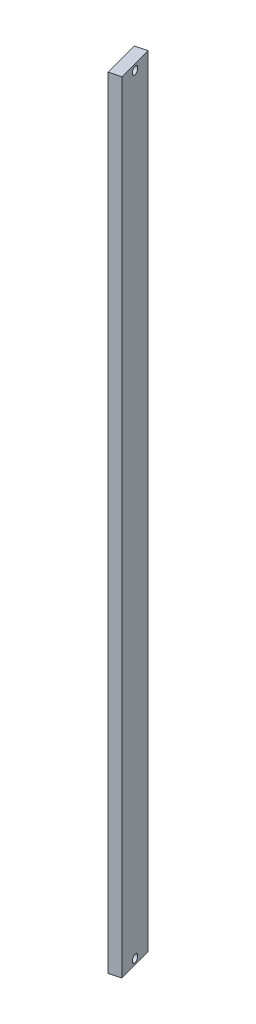
ISO-10303-21;
HEADER;
FILE_DESCRIPTION(('STEP AP214'),'2;1');
FILE_NAME('part.step','',(''),(''),'','','');
FILE_SCHEMA(('AUTOMOTIVE_DESIGN { 1 0 10303 214 1 1 1 1 }'));
ENDSEC;
DATA;
#1=APPLICATION_CONTEXT('core data for automotive mechanical design processes');
#2=APPLICATION_PROTOCOL_DEFINITION('international standard','automotive_design',2000,#1);
#3=PRODUCT_CONTEXT('',#1,'mechanical');
#4=PRODUCT('Part','Part','',(#3));
#5=PRODUCT_RELATED_PRODUCT_CATEGORY('part','',(#4));
#6=PRODUCT_DEFINITION_FORMATION('','',#4);
#7=PRODUCT_DEFINITION_CONTEXT('part definition',#1,'design');
#8=PRODUCT_DEFINITION('design','',#6,#7);
#9=PRODUCT_DEFINITION_SHAPE('','',#8);
#10=(LENGTH_UNIT() NAMED_UNIT(*) SI_UNIT(.MILLI.,.METRE.));
#11=(NAMED_UNIT(*) PLANE_ANGLE_UNIT() SI_UNIT($,.RADIAN.));
#12=(NAMED_UNIT(*) SI_UNIT($,.STERADIAN.) SOLID_ANGLE_UNIT());
#13=UNCERTAINTY_MEASURE_WITH_UNIT(LENGTH_MEASURE(1.E-05),#10,'distance_accuracy_value','');
#14=(GEOMETRIC_REPRESENTATION_CONTEXT(3) GLOBAL_UNCERTAINTY_ASSIGNED_CONTEXT((#13)) GLOBAL_UNIT_ASSIGNED_CONTEXT((#10,
#11,#12)) REPRESENTATION_CONTEXT('',''));
#15=CARTESIAN_POINT('',(0.,0.,0.));
#16=DIRECTION('',(0.,0.,1.));
#17=DIRECTION('',(1.,0.,0.));
#18=AXIS2_PLACEMENT_3D('',#15,#16,#17);
#19=CARTESIAN_POINT('',(2.64224849201071,431.8,9.86100561840613));
#20=DIRECTION('',(-0.258819045102523,0.,-0.965925826289068));
#21=DIRECTION('',(-0.965925826289068,0.,0.258819045102523));
#22=AXIS2_PLACEMENT_3D('',#19,#20,#21);
#23=PLANE('',#22);
#24=DIRECTION('',(0.965925826289068,0.,-0.258819045102523));
#25=VECTOR('',#24,1.);
#26=CARTESIAN_POINT('',(2.64224849201071,0.,9.86100561840613));
#27=LINE('',#26,#25);
#28=CARTESIAN_POINT('',(39.4440224736242,0.,0.));
#29=VERTEX_POINT('',#28);
#30=CARTESIAN_POINT('',(45.5776514705598,0.,-1.64350093640101));
#31=VERTEX_POINT('',#30);
#32=EDGE_CURVE('E98',#29,#31,#27,.T.);
#33=ORIENTED_EDGE('',*,*,#32,.T.);
#34=DIRECTION('',(0.,-1.,0.));
#35=VECTOR('',#34,1.);
#36=CARTESIAN_POINT('',(45.5776514705598,431.8,-1.64350093640101));
#37=LINE('',#36,#35);
#38=CARTESIAN_POINT('',(45.5776514705598,431.8,-1.64350093640101));
#39=VERTEX_POINT('',#38);
#40=EDGE_CURVE('E11',#39,#31,#37,.T.);
#41=ORIENTED_EDGE('',*,*,#40,.F.);
#42=DIRECTION('',(0.965925826289068,0.,-0.258819045102523));
#43=VECTOR('',#42,1.);
#44=CARTESIAN_POINT('',(2.64224849201071,431.8,9.86100561840613));
#45=LINE('',#44,#43);
#46=CARTESIAN_POINT('',(39.4440224736242,431.8,0.));
#47=VERTEX_POINT('',#46);
#48=EDGE_CURVE('E84',#47,#39,#45,.T.);
#49=ORIENTED_EDGE('',*,*,#48,.F.);
#50=DIRECTION('',(0.,-1.,0.));
#51=VECTOR('',#50,1.);
#52=CARTESIAN_POINT('',(39.4440224736242,431.8,0.));
#53=LINE('',#52,#51);
#54=EDGE_CURVE('E51',#47,#29,#53,.T.);
#55=ORIENTED_EDGE('',*,*,#54,.T.);
#56=EDGE_LOOP('',(#33,#41,#49,#55));
#57=FACE_BOUND('',#56,.T.);
#58=ADVANCED_FACE('F35',(#57),#23,.F.);
#59=CARTESIAN_POINT('',(42.9354029785491,431.8,-11.5045065548071));
#60=DIRECTION('',(-0.965925826289068,0.,0.258819045102521));
#61=DIRECTION('',(0.258819045102521,0.,0.965925826289068));
#62=AXIS2_PLACEMENT_3D('',#59,#60,#61);
#63=PLANE('',#62);
#64=CARTESIAN_POINT('',(42.935402978549,3.175,-11.5045065548073));
#65=DIRECTION('',(-0.965925826289068,0.,0.258819045102521));
#66=DIRECTION('',(0.258819045102521,0.,0.965925826289068));
#67=AXIS2_PLACEMENT_3D('',#64,#65,#66);
#68=CIRCLE('',#67,2.09549999999999);
#69=CARTESIAN_POINT('',(43.4777582875614,3.175,-9.48040898581851));
#70=VERTEX_POINT('',#69);
#71=EDGE_CURVE('E115',#70,#70,#68,.T.);
#72=ORIENTED_EDGE('',*,*,#71,.T.);
#73=EDGE_LOOP('',(#72));
#74=FACE_BOUND('',#73,.T.);
#75=CARTESIAN_POINT('',(42.9354029785491,428.625,-11.5045065548069));
#76=DIRECTION('',(-0.965925826289068,0.,0.258819045102521));
#77=DIRECTION('',(0.258819045102521,0.,0.965925826289068));
#78=AXIS2_PLACEMENT_3D('',#75,#76,#77);
#79=CIRCLE('',#78,2.0955);
#80=CARTESIAN_POINT('',(43.4777582875615,428.625,-9.48040898581817));
#81=VERTEX_POINT('',#80);
#82=EDGE_CURVE('E100',#81,#81,#79,.T.);
#83=ORIENTED_EDGE('',*,*,#82,.T.);
#84=EDGE_LOOP('',(#83));
#85=FACE_BOUND('',#84,.T.);
#86=DIRECTION('',(-0.258819045102521,0.,-0.965925826289068));
#87=VECTOR('',#86,1.);
#88=CARTESIAN_POINT('',(42.9354029785491,0.,-11.5045065548071));
#89=LINE('',#88,#87);
#90=CARTESIAN_POINT('',(40.2931544865384,0.,-21.3655121732131));
#91=VERTEX_POINT('',#90);
#92=EDGE_CURVE('E89',#31,#91,#89,.T.);
#93=ORIENTED_EDGE('',*,*,#92,.T.);
#94=DIRECTION('',(0.,-1.,0.));
#95=VECTOR('',#94,1.);
#96=CARTESIAN_POINT('',(40.2931544865384,431.8,-21.3655121732131));
#97=LINE('',#96,#95);
#98=CARTESIAN_POINT('',(40.2931544865384,431.8,-21.3655121732131));
#99=VERTEX_POINT('',#98);
#100=EDGE_CURVE('E43',#99,#91,#97,.T.);
#101=ORIENTED_EDGE('',*,*,#100,.F.);
#102=DIRECTION('',(-0.258819045102521,0.,-0.965925826289068));
#103=VECTOR('',#102,1.);
#104=CARTESIAN_POINT('',(42.9354029785491,431.8,-11.5045065548071));
#105=LINE('',#104,#103);
#106=EDGE_CURVE('E76',#39,#99,#105,.T.);
#107=ORIENTED_EDGE('',*,*,#106,.F.);
#108=ORIENTED_EDGE('',*,*,#40,.T.);
#109=EDGE_LOOP('',(#93,#101,#107,#108));
#110=FACE_BOUND('',#109,.T.);
#111=ADVANCED_FACE('F88',(#74,#85,#110),#63,.F.);
#112=CARTESIAN_POINT('',(-2.64224849201066,431.8,-9.86100561840601));
#113=DIRECTION('',(-0.258819045102521,0.,-0.965925826289068));
#114=DIRECTION('',(-0.965925826289068,0.,0.258819045102521));
#115=AXIS2_PLACEMENT_3D('',#112,#113,#114);
#116=PLANE('',#115);
#117=DIRECTION('',(0.965925826289068,0.,-0.258819045102521));
#118=VECTOR('',#117,1.);
#119=CARTESIAN_POINT('',(-2.64224849201066,0.,-9.86100561840601));
#120=LINE('',#119,#118);
#121=CARTESIAN_POINT('',(34.1595254896028,0.,-19.7220112368121));
#122=VERTEX_POINT('',#121);
#123=EDGE_CURVE('E102',#122,#91,#120,.T.);
#124=ORIENTED_EDGE('',*,*,#123,.F.);
#125=DIRECTION('',(0.,-1.,0.));
#126=VECTOR('',#125,1.);
#127=CARTESIAN_POINT('',(34.1595254896028,431.8,-19.7220112368121));
#128=LINE('',#127,#126);
#129=CARTESIAN_POINT('',(34.1595254896028,431.8,-19.7220112368121));
#130=VERTEX_POINT('',#129);
#131=EDGE_CURVE('E65',#130,#122,#128,.T.);
#132=ORIENTED_EDGE('',*,*,#131,.F.);
#133=DIRECTION('',(0.965925826289068,0.,-0.258819045102521));
#134=VECTOR('',#133,1.);
#135=CARTESIAN_POINT('',(-2.64224849201066,431.8,-9.86100561840601));
#136=LINE('',#135,#134);
#137=EDGE_CURVE('E83',#130,#99,#136,.T.);
#138=ORIENTED_EDGE('',*,*,#137,.T.);
#139=ORIENTED_EDGE('',*,*,#100,.T.);
#140=EDGE_LOOP('',(#124,#132,#138,#139));
#141=FACE_BOUND('',#140,.T.);
#142=ADVANCED_FACE('F92',(#141),#116,.T.);
#143=CARTESIAN_POINT('',(36.8017739816135,431.8,-9.86100561840605));
#144=DIRECTION('',(-0.965925826289068,0.,0.258819045102521));
#145=DIRECTION('',(0.258819045102521,0.,0.965925826289068));
#146=AXIS2_PLACEMENT_3D('',#143,#144,#145);
#147=PLANE('',#146);
#148=CARTESIAN_POINT('',(36.8017739816135,3.175,-9.86100561840625));
#149=DIRECTION('',(-0.965925826289068,0.,0.258819045102521));
#150=DIRECTION('',(0.258819045102521,0.,0.965925826289068));
#151=AXIS2_PLACEMENT_3D('',#148,#149,#150);
#152=CIRCLE('',#151,2.09549999999999);
#153=CARTESIAN_POINT('',(37.3441292906258,3.175,-7.83690804941751));
#154=VERTEX_POINT('',#153);
#155=EDGE_CURVE('E118',#154,#154,#152,.T.);
#156=ORIENTED_EDGE('',*,*,#155,.F.);
#157=EDGE_LOOP('',(#156));
#158=FACE_BOUND('',#157,.T.);
#159=CARTESIAN_POINT('',(36.8017739816136,428.625,-9.8610056184059));
#160=DIRECTION('',(-0.965925826289068,0.,0.258819045102521));
#161=DIRECTION('',(0.258819045102521,0.,0.965925826289068));
#162=AXIS2_PLACEMENT_3D('',#159,#160,#161);
#163=CIRCLE('',#162,2.0955);
#164=CARTESIAN_POINT('',(37.3441292906259,428.625,-7.83690804941716));
#165=VERTEX_POINT('',#164);
#166=EDGE_CURVE('E112',#165,#165,#163,.T.);
#167=ORIENTED_EDGE('',*,*,#166,.F.);
#168=EDGE_LOOP('',(#167));
#169=FACE_BOUND('',#168,.T.);
#170=DIRECTION('',(-0.258819045102521,0.,-0.965925826289068));
#171=VECTOR('',#170,1.);
#172=CARTESIAN_POINT('',(36.8017739816135,0.,-9.86100561840605));
#173=LINE('',#172,#171);
#174=EDGE_CURVE('E104',#29,#122,#173,.T.);
#175=ORIENTED_EDGE('',*,*,#174,.F.);
#176=ORIENTED_EDGE('',*,*,#54,.F.);
#177=DIRECTION('',(-0.258819045102521,0.,-0.965925826289068));
#178=VECTOR('',#177,1.);
#179=CARTESIAN_POINT('',(36.8017739816135,431.8,-9.86100561840605));
#180=LINE('',#179,#178);
#181=EDGE_CURVE('E93',#47,#130,#180,.T.);
#182=ORIENTED_EDGE('',*,*,#181,.T.);
#183=ORIENTED_EDGE('',*,*,#131,.T.);
#184=EDGE_LOOP('',(#175,#176,#182,#183));
#185=FACE_BOUND('',#184,.T.);
#186=ADVANCED_FACE('F125',(#158,#169,#185),#147,.T.);
#187=CARTESIAN_POINT('',(0.,431.8,0.));
#188=DIRECTION('',(0.,1.,0.));
#189=DIRECTION('',(0.,0.,1.));
#190=AXIS2_PLACEMENT_3D('',#187,#188,#189);
#191=PLANE('',#190);
#192=ORIENTED_EDGE('',*,*,#48,.T.);
#193=ORIENTED_EDGE('',*,*,#106,.T.);
#194=ORIENTED_EDGE('',*,*,#137,.F.);
#195=ORIENTED_EDGE('',*,*,#181,.F.);
#196=EDGE_LOOP('',(#192,#193,#194,#195));
#197=FACE_BOUND('',#196,.T.);
#198=ADVANCED_FACE('F80',(#197),#191,.T.);
#199=CARTESIAN_POINT('',(0.,0.,0.));
#200=DIRECTION('',(0.,1.,0.));
#201=DIRECTION('',(0.,0.,1.));
#202=AXIS2_PLACEMENT_3D('',#199,#200,#201);
#203=PLANE('',#202);
#204=ORIENTED_EDGE('',*,*,#32,.F.);
#205=ORIENTED_EDGE('',*,*,#174,.T.);
#206=ORIENTED_EDGE('',*,*,#123,.T.);
#207=ORIENTED_EDGE('',*,*,#92,.F.);
#208=EDGE_LOOP('',(#204,#205,#206,#207));
#209=FACE_BOUND('',#208,.T.);
#210=ADVANCED_FACE('F134',(#209),#203,.F.);
#211=CARTESIAN_POINT('',(47.8659057877522,428.625,-12.8256308008122));
#212=DIRECTION('',(-0.965925826289068,0.,0.258819045102521));
#213=DIRECTION('',(0.258819045102521,0.,0.965925826289068));
#214=AXIS2_PLACEMENT_3D('',#211,#212,#213);
#215=CYLINDRICAL_SURFACE('',#214,2.0955);
#216=ORIENTED_EDGE('',*,*,#166,.T.);
#217=EDGE_LOOP('',(#216));
#218=FACE_BOUND('',#217,.T.);
#219=ORIENTED_EDGE('',*,*,#82,.F.);
#220=EDGE_LOOP('',(#219));
#221=FACE_BOUND('',#220,.T.);
#222=ADVANCED_FACE('F131',(#218,#221),#215,.F.);
#223=CARTESIAN_POINT('',(47.8659057877521,3.175,-12.8256308008126));
#224=DIRECTION('',(-0.965925826289068,0.,0.258819045102521));
#225=DIRECTION('',(0.258819045102521,0.,0.965925826289068));
#226=AXIS2_PLACEMENT_3D('',#223,#224,#225);
#227=CYLINDRICAL_SURFACE('',#226,2.09549999999999);
#228=ORIENTED_EDGE('',*,*,#155,.T.);
#229=EDGE_LOOP('',(#228));
#230=FACE_BOUND('',#229,.T.);
#231=ORIENTED_EDGE('',*,*,#71,.F.);
#232=EDGE_LOOP('',(#231));
#233=FACE_BOUND('',#232,.T.);
#234=ADVANCED_FACE('F122',(#230,#233),#227,.F.);
#235=CLOSED_SHELL('',(#58,#111,#142,#186,#198,#210,#222,#234));
#236=MANIFOLD_SOLID_BREP('B2',#235);
#237=ADVANCED_BREP_SHAPE_REPRESENTATION('',(#18,#236),#14);
#238=SHAPE_DEFINITION_REPRESENTATION(#9,#237);
ENDSEC;
END-ISO-10303-21;
